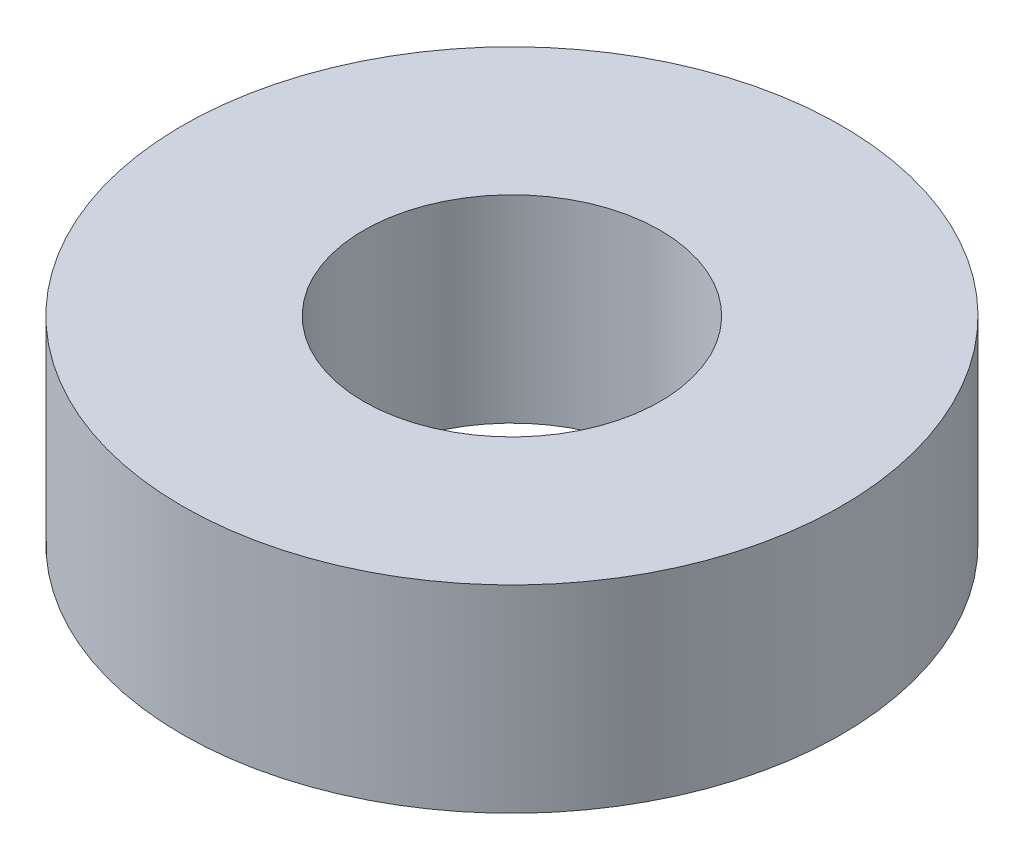
ISO-10303-21;
HEADER;
FILE_DESCRIPTION(('STEP AP214'),'2;1');
FILE_NAME('part.step','',(''),(''),'','','');
FILE_SCHEMA(('AUTOMOTIVE_DESIGN { 1 0 10303 214 1 1 1 1 }'));
ENDSEC;
DATA;
#1=APPLICATION_CONTEXT('core data for automotive mechanical design processes');
#2=APPLICATION_PROTOCOL_DEFINITION('international standard','automotive_design',2000,#1);
#3=PRODUCT_CONTEXT('',#1,'mechanical');
#4=PRODUCT('Part','Part','',(#3));
#5=PRODUCT_RELATED_PRODUCT_CATEGORY('part','',(#4));
#6=PRODUCT_DEFINITION_FORMATION('','',#4);
#7=PRODUCT_DEFINITION_CONTEXT('part definition',#1,'design');
#8=PRODUCT_DEFINITION('design','',#6,#7);
#9=PRODUCT_DEFINITION_SHAPE('','',#8);
#10=(LENGTH_UNIT() NAMED_UNIT(*) SI_UNIT(.MILLI.,.METRE.));
#11=(NAMED_UNIT(*) PLANE_ANGLE_UNIT() SI_UNIT($,.RADIAN.));
#12=(NAMED_UNIT(*) SI_UNIT($,.STERADIAN.) SOLID_ANGLE_UNIT());
#13=UNCERTAINTY_MEASURE_WITH_UNIT(LENGTH_MEASURE(1.E-05),#10,'distance_accuracy_value','');
#14=(GEOMETRIC_REPRESENTATION_CONTEXT(3) GLOBAL_UNCERTAINTY_ASSIGNED_CONTEXT((#13)) GLOBAL_UNIT_ASSIGNED_CONTEXT((#10,
#11,#12)) REPRESENTATION_CONTEXT('',''));
#15=CARTESIAN_POINT('',(0.,0.,0.));
#16=DIRECTION('',(0.,0.,1.));
#17=DIRECTION('',(1.,0.,0.));
#18=AXIS2_PLACEMENT_3D('',#15,#16,#17);
#19=CARTESIAN_POINT('',(0.,6.,0.));
#20=DIRECTION('',(0.,1.,0.));
#21=DIRECTION('',(0.,0.,1.));
#22=AXIS2_PLACEMENT_3D('',#19,#20,#21);
#23=PLANE('',#22);
#24=CARTESIAN_POINT('',(0.,6.,0.));
#25=DIRECTION('',(0.,1.,0.));
#26=DIRECTION('',(0.,0.,1.));
#27=AXIS2_PLACEMENT_3D('',#24,#25,#26);
#28=CIRCLE('',#27,10.);
#29=CARTESIAN_POINT('',(0.,6.,10.));
#30=VERTEX_POINT('',#29);
#31=EDGE_CURVE('E10',#30,#30,#28,.T.);
#32=ORIENTED_EDGE('',*,*,#31,.T.);
#33=EDGE_LOOP('',(#32));
#34=FACE_BOUND('',#33,.T.);
#35=CARTESIAN_POINT('',(0.,6.,0.));
#36=DIRECTION('',(0.,1.,0.));
#37=DIRECTION('',(0.,0.,1.));
#38=AXIS2_PLACEMENT_3D('',#35,#36,#37);
#39=CIRCLE('',#38,4.5);
#40=CARTESIAN_POINT('',(0.,6.,4.5));
#41=VERTEX_POINT('',#40);
#42=EDGE_CURVE('E48',#41,#41,#39,.T.);
#43=ORIENTED_EDGE('',*,*,#42,.F.);
#44=EDGE_LOOP('',(#43));
#45=FACE_BOUND('',#44,.T.);
#46=ADVANCED_FACE('F37',(#34,#45),#23,.T.);
#47=CARTESIAN_POINT('',(0.,0.,0.));
#48=DIRECTION('',(0.,1.,0.));
#49=DIRECTION('',(0.,0.,1.));
#50=AXIS2_PLACEMENT_3D('',#47,#48,#49);
#51=PLANE('',#50);
#52=CARTESIAN_POINT('',(0.,0.,0.));
#53=DIRECTION('',(0.,1.,0.));
#54=DIRECTION('',(0.,0.,1.));
#55=AXIS2_PLACEMENT_3D('',#52,#53,#54);
#56=CIRCLE('',#55,10.);
#57=CARTESIAN_POINT('',(0.,0.,10.));
#58=VERTEX_POINT('',#57);
#59=EDGE_CURVE('E41',#58,#58,#56,.T.);
#60=ORIENTED_EDGE('',*,*,#59,.F.);
#61=EDGE_LOOP('',(#60));
#62=FACE_BOUND('',#61,.T.);
#63=CARTESIAN_POINT('',(0.,0.,0.));
#64=DIRECTION('',(0.,1.,0.));
#65=DIRECTION('',(0.,0.,1.));
#66=AXIS2_PLACEMENT_3D('',#63,#64,#65);
#67=CIRCLE('',#66,4.5);
#68=CARTESIAN_POINT('',(0.,0.,4.5));
#69=VERTEX_POINT('',#68);
#70=EDGE_CURVE('E50',#69,#69,#67,.T.);
#71=ORIENTED_EDGE('',*,*,#70,.T.);
#72=EDGE_LOOP('',(#71));
#73=FACE_BOUND('',#72,.T.);
#74=ADVANCED_FACE('F60',(#62,#73),#51,.F.);
#75=CARTESIAN_POINT('',(0.,6.,0.));
#76=DIRECTION('',(0.,-1.,0.));
#77=DIRECTION('',(0.,0.,-1.));
#78=AXIS2_PLACEMENT_3D('',#75,#76,#77);
#79=CYLINDRICAL_SURFACE('',#78,10.);
#80=ORIENTED_EDGE('',*,*,#31,.F.);
#81=EDGE_LOOP('',(#80));
#82=FACE_BOUND('',#81,.T.);
#83=ORIENTED_EDGE('',*,*,#59,.T.);
#84=EDGE_LOOP('',(#83));
#85=FACE_BOUND('',#84,.T.);
#86=ADVANCED_FACE('F39',(#82,#85),#79,.T.);
#87=CARTESIAN_POINT('',(0.,6.,0.));
#88=DIRECTION('',(0.,-1.,0.));
#89=DIRECTION('',(0.,0.,-1.));
#90=AXIS2_PLACEMENT_3D('',#87,#88,#89);
#91=CYLINDRICAL_SURFACE('',#90,4.5);
#92=ORIENTED_EDGE('',*,*,#42,.T.);
#93=EDGE_LOOP('',(#92));
#94=FACE_BOUND('',#93,.T.);
#95=ORIENTED_EDGE('',*,*,#70,.F.);
#96=EDGE_LOOP('',(#95));
#97=FACE_BOUND('',#96,.T.);
#98=ADVANCED_FACE('F56',(#94,#97),#91,.F.);
#99=CLOSED_SHELL('',(#46,#74,#86,#98));
#100=MANIFOLD_SOLID_BREP('B2',#99);
#101=ADVANCED_BREP_SHAPE_REPRESENTATION('',(#18,#100),#14);
#102=SHAPE_DEFINITION_REPRESENTATION(#9,#101);
ENDSEC;
END-ISO-10303-21;
